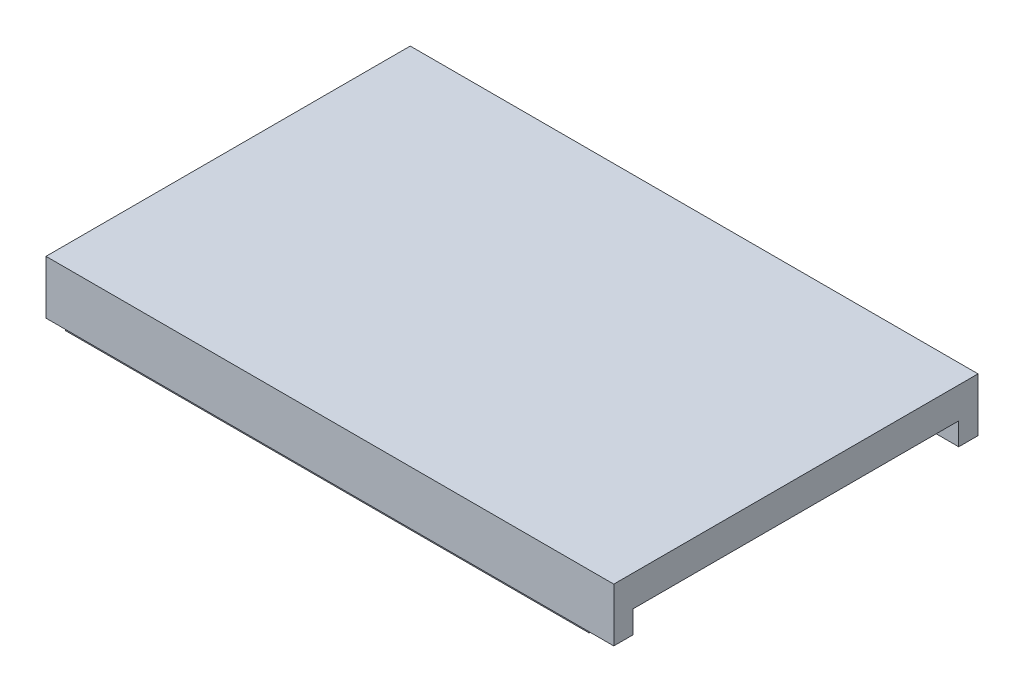
ISO-10303-21;
HEADER;
FILE_DESCRIPTION(('STEP AP214'),'2;1');
FILE_NAME('part.step','',(''),(''),'','','');
FILE_SCHEMA(('AUTOMOTIVE_DESIGN { 1 0 10303 214 1 1 1 1 }'));
ENDSEC;
DATA;
#1=APPLICATION_CONTEXT('core data for automotive mechanical design processes');
#2=APPLICATION_PROTOCOL_DEFINITION('international standard','automotive_design',2000,#1);
#3=PRODUCT_CONTEXT('',#1,'mechanical');
#4=PRODUCT('Part','Part','',(#3));
#5=PRODUCT_RELATED_PRODUCT_CATEGORY('part','',(#4));
#6=PRODUCT_DEFINITION_FORMATION('','',#4);
#7=PRODUCT_DEFINITION_CONTEXT('part definition',#1,'design');
#8=PRODUCT_DEFINITION('design','',#6,#7);
#9=PRODUCT_DEFINITION_SHAPE('','',#8);
#10=(LENGTH_UNIT() NAMED_UNIT(*) SI_UNIT(.MILLI.,.METRE.));
#11=(NAMED_UNIT(*) PLANE_ANGLE_UNIT() SI_UNIT($,.RADIAN.));
#12=(NAMED_UNIT(*) SI_UNIT($,.STERADIAN.) SOLID_ANGLE_UNIT());
#13=UNCERTAINTY_MEASURE_WITH_UNIT(LENGTH_MEASURE(1.E-05),#10,'distance_accuracy_value','');
#14=(GEOMETRIC_REPRESENTATION_CONTEXT(3) GLOBAL_UNCERTAINTY_ASSIGNED_CONTEXT((#13)) GLOBAL_UNIT_ASSIGNED_CONTEXT((#10,
#11,#12)) REPRESENTATION_CONTEXT('',''));
#15=CARTESIAN_POINT('',(0.,0.,0.));
#16=DIRECTION('',(0.,0.,1.));
#17=DIRECTION('',(1.,0.,0.));
#18=AXIS2_PLACEMENT_3D('',#15,#16,#17);
#19=CARTESIAN_POINT('',(0.,0.5,0.));
#20=DIRECTION('',(0.,-1.,0.));
#21=DIRECTION('',(0.,0.,-1.));
#22=AXIS2_PLACEMENT_3D('',#19,#20,#21);
#23=PLANE('',#22);
#24=DIRECTION('',(1.,0.,0.));
#25=VECTOR('',#24,1.);
#26=CARTESIAN_POINT('',(1.2,0.5,-6.6));
#27=LINE('',#26,#25);
#28=CARTESIAN_POINT('',(1.2,0.5,-6.6));
#29=VERTEX_POINT('',#28);
#30=CARTESIAN_POINT('',(5.,0.5,-6.6));
#31=VERTEX_POINT('',#30);
#32=EDGE_CURVE('E303',#29,#31,#27,.T.);
#33=ORIENTED_EDGE('',*,*,#32,.T.);
#34=CARTESIAN_POINT('',(5.,0.5,-5.));
#35=DIRECTION('',(0.,-1.,0.));
#36=DIRECTION('',(0.,0.,-1.));
#37=AXIS2_PLACEMENT_3D('',#34,#35,#36);
#38=CIRCLE('',#37,1.6);
#39=CARTESIAN_POINT('',(6.6,0.5,-5.));
#40=VERTEX_POINT('',#39);
#41=EDGE_CURVE('E11',#31,#40,#38,.F.);
#42=ORIENTED_EDGE('',*,*,#41,.T.);
#43=DIRECTION('',(0.,0.,1.));
#44=VECTOR('',#43,1.);
#45=CARTESIAN_POINT('',(6.6,0.5,-1.2));
#46=LINE('',#45,#44);
#47=CARTESIAN_POINT('',(6.6,0.5,-1.2));
#48=VERTEX_POINT('',#47);
#49=EDGE_CURVE('E306',#40,#48,#46,.T.);
#50=ORIENTED_EDGE('',*,*,#49,.T.);
#51=DIRECTION('',(-1.,0.,0.));
#52=VECTOR('',#51,1.);
#53=CARTESIAN_POINT('',(1.2,0.5,-1.2));
#54=LINE('',#53,#52);
#55=CARTESIAN_POINT('',(1.2,0.5,-1.2));
#56=VERTEX_POINT('',#55);
#57=EDGE_CURVE('E310',#48,#56,#54,.T.);
#58=ORIENTED_EDGE('',*,*,#57,.T.);
#59=DIRECTION('',(0.,0.,-1.));
#60=VECTOR('',#59,1.);
#61=CARTESIAN_POINT('',(1.2,0.5,-1.2));
#62=LINE('',#61,#60);
#63=EDGE_CURVE('E298',#56,#29,#62,.T.);
#64=ORIENTED_EDGE('',*,*,#63,.T.);
#65=EDGE_LOOP('',(#33,#42,#50,#58,#64));
#66=FACE_BOUND('',#65,.T.);
#67=ADVANCED_FACE('F39',(#66),#23,.T.);
#68=CARTESIAN_POINT('',(1.2,3.5,-1.2));
#69=DIRECTION('',(-1.,0.,0.));
#70=DIRECTION('',(0.,0.,1.));
#71=AXIS2_PLACEMENT_3D('',#68,#69,#70);
#72=PLANE('',#71);
#73=DIRECTION('',(0.,1.,0.));
#74=VECTOR('',#73,1.);
#75=CARTESIAN_POINT('',(1.2,0.5,-28.5));
#76=LINE('',#75,#74);
#77=CARTESIAN_POINT('',(1.2,0.5,-28.5));
#78=VERTEX_POINT('',#77);
#79=CARTESIAN_POINT('',(1.2,3.5,-28.5));
#80=VERTEX_POINT('',#79);
#81=EDGE_CURVE('E285',#78,#80,#76,.T.);
#82=ORIENTED_EDGE('',*,*,#81,.T.);
#83=DIRECTION('',(0.,0.,-1.));
#84=VECTOR('',#83,1.);
#85=CARTESIAN_POINT('',(1.2,3.5,-1.2));
#86=LINE('',#85,#84);
#87=CARTESIAN_POINT('',(1.2,3.5,-6.6));
#88=VERTEX_POINT('',#87);
#89=EDGE_CURVE('E438',#88,#80,#86,.T.);
#90=ORIENTED_EDGE('',*,*,#89,.F.);
#91=DIRECTION('',(0.,1.,0.));
#92=VECTOR('',#91,1.);
#93=CARTESIAN_POINT('',(1.2,0.5,-6.6));
#94=LINE('',#93,#92);
#95=EDGE_CURVE('E320',#29,#88,#94,.T.);
#96=ORIENTED_EDGE('',*,*,#95,.F.);
#97=ORIENTED_EDGE('',*,*,#63,.F.);
#98=DIRECTION('',(0.,-1.,0.));
#99=VECTOR('',#98,1.);
#100=CARTESIAN_POINT('',(1.2,3.5,-1.2));
#101=LINE('',#100,#99);
#102=CARTESIAN_POINT('',(1.2,-1.,-1.2));
#103=VERTEX_POINT('',#102);
#104=EDGE_CURVE('E453',#56,#103,#101,.T.);
#105=ORIENTED_EDGE('',*,*,#104,.T.);
#106=DIRECTION('',(0.,0.,1.));
#107=VECTOR('',#106,1.);
#108=CARTESIAN_POINT('',(1.2,-1.,-1.2));
#109=LINE('',#108,#107);
#110=CARTESIAN_POINT('',(1.2,-1.,-12.));
#111=VERTEX_POINT('',#110);
#112=EDGE_CURVE('E411',#111,#103,#109,.T.);
#113=ORIENTED_EDGE('',*,*,#112,.F.);
#114=DIRECTION('',(0.,1.,0.));
#115=VECTOR('',#114,1.);
#116=CARTESIAN_POINT('',(1.2,-1.,-12.));
#117=LINE('',#116,#115);
#118=CARTESIAN_POINT('',(1.2,0.5,-12.));
#119=VERTEX_POINT('',#118);
#120=EDGE_CURVE('E426',#111,#119,#117,.T.);
#121=ORIENTED_EDGE('',*,*,#120,.T.);
#122=DIRECTION('',(0.,0.,1.));
#123=VECTOR('',#122,1.);
#124=CARTESIAN_POINT('',(1.2,0.5,-12.));
#125=LINE('',#124,#123);
#126=CARTESIAN_POINT('',(1.2,0.5,-22.));
#127=VERTEX_POINT('',#126);
#128=EDGE_CURVE('E347',#127,#119,#125,.T.);
#129=ORIENTED_EDGE('',*,*,#128,.F.);
#130=DIRECTION('',(0.,1.,0.));
#131=VECTOR('',#130,1.);
#132=CARTESIAN_POINT('',(1.2,-1.,-22.));
#133=LINE('',#132,#131);
#134=CARTESIAN_POINT('',(1.2,-1.,-22.));
#135=VERTEX_POINT('',#134);
#136=EDGE_CURVE('E382',#135,#127,#133,.T.);
#137=ORIENTED_EDGE('',*,*,#136,.F.);
#138=DIRECTION('',(0.,0.,1.));
#139=VECTOR('',#138,1.);
#140=CARTESIAN_POINT('',(1.2,-1.,-22.));
#141=LINE('',#140,#139);
#142=CARTESIAN_POINT('',(1.2,-1.,-32.8));
#143=VERTEX_POINT('',#142);
#144=EDGE_CURVE('E380',#143,#135,#141,.T.);
#145=ORIENTED_EDGE('',*,*,#144,.F.);
#146=DIRECTION('',(0.,-1.,0.));
#147=VECTOR('',#146,1.);
#148=CARTESIAN_POINT('',(1.2,3.5,-32.8));
#149=LINE('',#148,#147);
#150=CARTESIAN_POINT('',(1.2,0.5,-32.8));
#151=VERTEX_POINT('',#150);
#152=EDGE_CURVE('E450',#151,#143,#149,.T.);
#153=ORIENTED_EDGE('',*,*,#152,.F.);
#154=DIRECTION('',(0.,0.,-1.));
#155=VECTOR('',#154,1.);
#156=CARTESIAN_POINT('',(1.2,0.5,-32.8));
#157=LINE('',#156,#155);
#158=EDGE_CURVE('E59',#78,#151,#157,.T.);
#159=ORIENTED_EDGE('',*,*,#158,.F.);
#160=EDGE_LOOP('',(#82,#90,#96,#97,#105,#113,#121,#129,#137,#145,#153,#159));
#161=FACE_BOUND('',#160,.T.);
#162=ADVANCED_FACE('F544',(#161),#72,.F.);
#163=CARTESIAN_POINT('',(0.,3.5,0.));
#164=DIRECTION('',(0.,-1.,0.));
#165=DIRECTION('',(0.,0.,-1.));
#166=AXIS2_PLACEMENT_3D('',#163,#164,#165);
#167=PLANE('',#166);
#168=DIRECTION('',(-1.,0.,0.));
#169=VECTOR('',#168,1.);
#170=CARTESIAN_POINT('',(1.2,3.5,-28.5));
#171=LINE('',#170,#169);
#172=CARTESIAN_POINT('',(6.6,3.5,-28.5));
#173=VERTEX_POINT('',#172);
#174=EDGE_CURVE('E277',#173,#80,#171,.T.);
#175=ORIENTED_EDGE('',*,*,#174,.F.);
#176=DIRECTION('',(0.,0.,1.));
#177=VECTOR('',#176,1.);
#178=CARTESIAN_POINT('',(6.6,3.5,-32.8));
#179=LINE('',#178,#177);
#180=CARTESIAN_POINT('',(6.6,3.5,-32.8));
#181=VERTEX_POINT('',#180);
#182=EDGE_CURVE('E273',#181,#173,#179,.T.);
#183=ORIENTED_EDGE('',*,*,#182,.F.);
#184=DIRECTION('',(1.,0.,0.));
#185=VECTOR('',#184,1.);
#186=CARTESIAN_POINT('',(1.2,3.5,-32.8));
#187=LINE('',#186,#185);
#188=CARTESIAN_POINT('',(49.8,3.5,-32.8));
#189=VERTEX_POINT('',#188);
#190=EDGE_CURVE('E441',#181,#189,#187,.T.);
#191=ORIENTED_EDGE('',*,*,#190,.T.);
#192=DIRECTION('',(0.,0.,1.));
#193=VECTOR('',#192,1.);
#194=CARTESIAN_POINT('',(49.8,3.5,-1.2));
#195=LINE('',#194,#193);
#196=CARTESIAN_POINT('',(49.8,3.5,-1.2));
#197=VERTEX_POINT('',#196);
#198=EDGE_CURVE('E444',#189,#197,#195,.T.);
#199=ORIENTED_EDGE('',*,*,#198,.T.);
#200=DIRECTION('',(-1.,0.,0.));
#201=VECTOR('',#200,1.);
#202=CARTESIAN_POINT('',(1.2,3.5,-1.2));
#203=LINE('',#202,#201);
#204=CARTESIAN_POINT('',(6.6,3.5,-1.2));
#205=VERTEX_POINT('',#204);
#206=EDGE_CURVE('E447',#197,#205,#203,.T.);
#207=ORIENTED_EDGE('',*,*,#206,.T.);
#208=DIRECTION('',(0.,0.,1.));
#209=VECTOR('',#208,1.);
#210=CARTESIAN_POINT('',(6.6,3.5,-1.2));
#211=LINE('',#210,#209);
#212=CARTESIAN_POINT('',(6.6,3.5,-6.6));
#213=VERTEX_POINT('',#212);
#214=EDGE_CURVE('E302',#213,#205,#211,.T.);
#215=ORIENTED_EDGE('',*,*,#214,.F.);
#216=DIRECTION('',(1.,0.,0.));
#217=VECTOR('',#216,1.);
#218=CARTESIAN_POINT('',(1.2,3.5,-6.6));
#219=LINE('',#218,#217);
#220=EDGE_CURVE('E297',#88,#213,#219,.T.);
#221=ORIENTED_EDGE('',*,*,#220,.F.);
#222=ORIENTED_EDGE('',*,*,#89,.T.);
#223=EDGE_LOOP('',(#175,#183,#191,#199,#207,#215,#221,#222));
#224=FACE_BOUND('',#223,.T.);
#225=ADVANCED_FACE('F585',(#224),#167,.T.);
#226=CARTESIAN_POINT('',(1.2,3.5,-32.8));
#227=DIRECTION('',(0.,0.,-1.));
#228=DIRECTION('',(-1.,0.,0.));
#229=AXIS2_PLACEMENT_3D('',#226,#227,#228);
#230=PLANE('',#229);
#231=DIRECTION('',(0.,1.,0.));
#232=VECTOR('',#231,1.);
#233=CARTESIAN_POINT('',(6.6,0.5,-32.8));
#234=LINE('',#233,#232);
#235=CARTESIAN_POINT('',(6.6,0.5,-32.8));
#236=VERTEX_POINT('',#235);
#237=EDGE_CURVE('E294',#236,#181,#234,.T.);
#238=ORIENTED_EDGE('',*,*,#237,.F.);
#239=DIRECTION('',(1.,0.,0.));
#240=VECTOR('',#239,1.);
#241=CARTESIAN_POINT('',(1.2,0.5,-32.8));
#242=LINE('',#241,#240);
#243=EDGE_CURVE('E276',#151,#236,#242,.T.);
#244=ORIENTED_EDGE('',*,*,#243,.F.);
#245=ORIENTED_EDGE('',*,*,#152,.T.);
#246=DIRECTION('',(-1.,0.,0.));
#247=VECTOR('',#246,1.);
#248=CARTESIAN_POINT('',(1.2,-1.,-32.8));
#249=LINE('',#248,#247);
#250=CARTESIAN_POINT('',(49.8,-1.,-32.8));
#251=VERTEX_POINT('',#250);
#252=EDGE_CURVE('E377',#251,#143,#249,.T.);
#253=ORIENTED_EDGE('',*,*,#252,.F.);
#254=DIRECTION('',(0.,1.,0.));
#255=VECTOR('',#254,1.);
#256=CARTESIAN_POINT('',(49.8,-1.,-32.8));
#257=LINE('',#256,#255);
#258=CARTESIAN_POINT('',(49.8,0.,-32.8));
#259=VERTEX_POINT('',#258);
#260=EDGE_CURVE('E389',#251,#259,#257,.T.);
#261=ORIENTED_EDGE('',*,*,#260,.T.);
#262=DIRECTION('',(0.,-1.,0.));
#263=VECTOR('',#262,1.);
#264=CARTESIAN_POINT('',(49.8,3.5,-32.8));
#265=LINE('',#264,#263);
#266=EDGE_CURVE('E459',#189,#259,#265,.T.);
#267=ORIENTED_EDGE('',*,*,#266,.F.);
#268=ORIENTED_EDGE('',*,*,#190,.F.);
#269=EDGE_LOOP('',(#238,#244,#245,#253,#261,#267,#268));
#270=FACE_BOUND('',#269,.T.);
#271=ADVANCED_FACE('F640',(#270),#230,.F.);
#272=CARTESIAN_POINT('',(1.2,3.5,-1.2));
#273=DIRECTION('',(0.,0.,1.));
#274=DIRECTION('',(1.,0.,0.));
#275=AXIS2_PLACEMENT_3D('',#272,#273,#274);
#276=PLANE('',#275);
#277=DIRECTION('',(0.,1.,0.));
#278=VECTOR('',#277,1.);
#279=CARTESIAN_POINT('',(6.6,0.5,-1.2));
#280=LINE('',#279,#278);
#281=EDGE_CURVE('E312',#48,#205,#280,.T.);
#282=ORIENTED_EDGE('',*,*,#281,.T.);
#283=ORIENTED_EDGE('',*,*,#206,.F.);
#284=DIRECTION('',(0.,-1.,0.));
#285=VECTOR('',#284,1.);
#286=CARTESIAN_POINT('',(49.8,3.5,-1.2));
#287=LINE('',#286,#285);
#288=CARTESIAN_POINT('',(49.8,0.,-1.2));
#289=VERTEX_POINT('',#288);
#290=EDGE_CURVE('E456',#197,#289,#287,.T.);
#291=ORIENTED_EDGE('',*,*,#290,.T.);
#292=DIRECTION('',(0.,1.,0.));
#293=VECTOR('',#292,1.);
#294=CARTESIAN_POINT('',(49.8,-1.,-1.2));
#295=LINE('',#294,#293);
#296=CARTESIAN_POINT('',(49.8,-1.,-1.2));
#297=VERTEX_POINT('',#296);
#298=EDGE_CURVE('E416',#297,#289,#295,.T.);
#299=ORIENTED_EDGE('',*,*,#298,.F.);
#300=DIRECTION('',(1.,0.,0.));
#301=VECTOR('',#300,1.);
#302=CARTESIAN_POINT('',(49.8,-1.,-1.2));
#303=LINE('',#302,#301);
#304=EDGE_CURVE('E414',#103,#297,#303,.T.);
#305=ORIENTED_EDGE('',*,*,#304,.F.);
#306=ORIENTED_EDGE('',*,*,#104,.F.);
#307=ORIENTED_EDGE('',*,*,#57,.F.);
#308=EDGE_LOOP('',(#282,#283,#291,#299,#305,#306,#307));
#309=FACE_BOUND('',#308,.T.);
#310=ADVANCED_FACE('F564',(#309),#276,.F.);
#311=CARTESIAN_POINT('',(0.,0.,0.));
#312=DIRECTION('',(0.,-1.,0.));
#313=DIRECTION('',(0.,0.,-1.));
#314=AXIS2_PLACEMENT_3D('',#311,#312,#313);
#315=PLANE('',#314);
#316=DIRECTION('',(-1.,0.,0.));
#317=VECTOR('',#316,1.);
#318=CARTESIAN_POINT('',(49.8,0.,-1.8));
#319=LINE('',#318,#317);
#320=CARTESIAN_POINT('',(53.,0.,-1.8));
#321=VERTEX_POINT('',#320);
#322=CARTESIAN_POINT('',(49.8,0.,-1.8));
#323=VERTEX_POINT('',#322);
#324=EDGE_CURVE('E327',#321,#323,#319,.T.);
#325=ORIENTED_EDGE('',*,*,#324,.F.);
#326=DIRECTION('',(0.,0.,-1.));
#327=VECTOR('',#326,1.);
#328=CARTESIAN_POINT('',(53.,0.,0.));
#329=LINE('',#328,#327);
#330=CARTESIAN_POINT('',(53.,0.,0.));
#331=VERTEX_POINT('',#330);
#332=EDGE_CURVE('E480',#331,#321,#329,.T.);
#333=ORIENTED_EDGE('',*,*,#332,.F.);
#334=DIRECTION('',(1.,0.,0.));
#335=VECTOR('',#334,1.);
#336=CARTESIAN_POINT('',(0.,0.,0.));
#337=LINE('',#336,#335);
#338=CARTESIAN_POINT('',(0.,0.,0.));
#339=VERTEX_POINT('',#338);
#340=EDGE_CURVE('E477',#339,#331,#337,.T.);
#341=ORIENTED_EDGE('',*,*,#340,.F.);
#342=DIRECTION('',(0.,0.,1.));
#343=VECTOR('',#342,1.);
#344=CARTESIAN_POINT('',(0.,0.,0.));
#345=LINE('',#344,#343);
#346=CARTESIAN_POINT('',(0.,0.,-12.));
#347=VERTEX_POINT('',#346);
#348=EDGE_CURVE('E455',#347,#339,#345,.T.);
#349=ORIENTED_EDGE('',*,*,#348,.F.);
#350=DIRECTION('',(-1.,0.,0.));
#351=VECTOR('',#350,1.);
#352=CARTESIAN_POINT('',(1.2,0.,-12.));
#353=LINE('',#352,#351);
#354=CARTESIAN_POINT('',(0.9,0.,-12.));
#355=VERTEX_POINT('',#354);
#356=EDGE_CURVE('E340',#355,#347,#353,.T.);
#357=ORIENTED_EDGE('',*,*,#356,.F.);
#358=DIRECTION('',(0.,0.,-1.));
#359=VECTOR('',#358,1.);
#360=CARTESIAN_POINT('',(0.9,0.,-0.9));
#361=LINE('',#360,#359);
#362=CARTESIAN_POINT('',(0.9,0.,-0.9));
#363=VERTEX_POINT('',#362);
#364=EDGE_CURVE('E405',#363,#355,#361,.T.);
#365=ORIENTED_EDGE('',*,*,#364,.F.);
#366=DIRECTION('',(-1.,0.,0.));
#367=VECTOR('',#366,1.);
#368=CARTESIAN_POINT('',(49.8,0.,-0.9));
#369=LINE('',#368,#367);
#370=CARTESIAN_POINT('',(49.8,0.,-0.9));
#371=VERTEX_POINT('',#370);
#372=EDGE_CURVE('E419',#371,#363,#369,.T.);
#373=ORIENTED_EDGE('',*,*,#372,.F.);
#374=DIRECTION('',(0.,0.,1.));
#375=VECTOR('',#374,1.);
#376=CARTESIAN_POINT('',(49.8,0.,-0.9));
#377=LINE('',#376,#375);
#378=EDGE_CURVE('E400',#289,#371,#377,.T.);
#379=ORIENTED_EDGE('',*,*,#378,.F.);
#380=DIRECTION('',(0.,0.,1.));
#381=VECTOR('',#380,1.);
#382=CARTESIAN_POINT('',(49.8,0.,-1.2));
#383=LINE('',#382,#381);
#384=EDGE_CURVE('E437',#323,#289,#383,.T.);
#385=ORIENTED_EDGE('',*,*,#384,.F.);
#386=EDGE_LOOP('',(#325,#333,#341,#349,#357,#365,#373,#379,#385));
#387=FACE_BOUND('',#386,.T.);
#388=ADVANCED_FACE('F504',(#387),#315,.T.);
#389=DIRECTION('',(1.,0.,0.));
#390=VECTOR('',#389,1.);
#391=CARTESIAN_POINT('',(49.8,0.,-32.2));
#392=LINE('',#391,#390);
#393=CARTESIAN_POINT('',(49.8,0.,-32.2));
#394=VERTEX_POINT('',#393);
#395=CARTESIAN_POINT('',(53.,0.,-32.2));
#396=VERTEX_POINT('',#395);
#397=EDGE_CURVE('E322',#394,#396,#392,.T.);
#398=ORIENTED_EDGE('',*,*,#397,.F.);
#399=EDGE_CURVE('E442',#259,#394,#383,.T.);
#400=ORIENTED_EDGE('',*,*,#399,.F.);
#401=DIRECTION('',(0.,0.,1.));
#402=VECTOR('',#401,1.);
#403=CARTESIAN_POINT('',(49.8,0.,-32.8));
#404=LINE('',#403,#402);
#405=CARTESIAN_POINT('',(49.8,0.,-33.1));
#406=VERTEX_POINT('',#405);
#407=EDGE_CURVE('E371',#406,#259,#404,.T.);
#408=ORIENTED_EDGE('',*,*,#407,.F.);
#409=DIRECTION('',(1.,0.,0.));
#410=VECTOR('',#409,1.);
#411=CARTESIAN_POINT('',(0.9,0.,-33.1));
#412=LINE('',#411,#410);
#413=CARTESIAN_POINT('',(0.9,0.,-33.1));
#414=VERTEX_POINT('',#413);
#415=EDGE_CURVE('E384',#414,#406,#412,.T.);
#416=ORIENTED_EDGE('',*,*,#415,.F.);
#417=DIRECTION('',(0.,0.,-1.));
#418=VECTOR('',#417,1.);
#419=CARTESIAN_POINT('',(0.9,0.,-22.));
#420=LINE('',#419,#418);
#421=CARTESIAN_POINT('',(0.9,0.,-22.));
#422=VERTEX_POINT('',#421);
#423=EDGE_CURVE('E364',#422,#414,#420,.T.);
#424=ORIENTED_EDGE('',*,*,#423,.F.);
#425=DIRECTION('',(1.,0.,0.));
#426=VECTOR('',#425,1.);
#427=CARTESIAN_POINT('',(1.2,0.,-22.));
#428=LINE('',#427,#426);
#429=CARTESIAN_POINT('',(0.,0.,-22.));
#430=VERTEX_POINT('',#429);
#431=EDGE_CURVE('E351',#430,#422,#428,.T.);
#432=ORIENTED_EDGE('',*,*,#431,.F.);
#433=CARTESIAN_POINT('',(0.,0.,-34.));
#434=VERTEX_POINT('',#433);
#435=EDGE_CURVE('E474',#434,#430,#345,.T.);
#436=ORIENTED_EDGE('',*,*,#435,.F.);
#437=DIRECTION('',(-1.,0.,0.));
#438=VECTOR('',#437,1.);
#439=CARTESIAN_POINT('',(0.,0.,-34.));
#440=LINE('',#439,#438);
#441=CARTESIAN_POINT('',(53.,0.,-34.));
#442=VERTEX_POINT('',#441);
#443=EDGE_CURVE('E467',#442,#434,#440,.T.);
#444=ORIENTED_EDGE('',*,*,#443,.F.);
#445=EDGE_CURVE('E479',#396,#442,#329,.T.);
#446=ORIENTED_EDGE('',*,*,#445,.F.);
#447=EDGE_LOOP('',(#398,#400,#408,#416,#424,#432,#436,#444,#446));
#448=FACE_BOUND('',#447,.T.);
#449=ADVANCED_FACE('F524',(#448),#315,.T.);
#450=CARTESIAN_POINT('',(0.,5.,0.));
#451=DIRECTION('',(1.,0.,0.));
#452=DIRECTION('',(0.,0.,-1.));
#453=AXIS2_PLACEMENT_3D('',#450,#451,#452);
#454=PLANE('',#453);
#455=ORIENTED_EDGE('',*,*,#435,.T.);
#456=DIRECTION('',(0.,-1.,0.));
#457=VECTOR('',#456,1.);
#458=CARTESIAN_POINT('',(0.,0.5,-22.));
#459=LINE('',#458,#457);
#460=CARTESIAN_POINT('',(0.,0.5,-22.));
#461=VERTEX_POINT('',#460);
#462=EDGE_CURVE('E362',#461,#430,#459,.T.);
#463=ORIENTED_EDGE('',*,*,#462,.F.);
#464=DIRECTION('',(0.,0.,-1.));
#465=VECTOR('',#464,1.);
#466=CARTESIAN_POINT('',(0.,0.5,-12.));
#467=LINE('',#466,#465);
#468=CARTESIAN_POINT('',(0.,0.5,-12.));
#469=VERTEX_POINT('',#468);
#470=EDGE_CURVE('E354',#469,#461,#467,.T.);
#471=ORIENTED_EDGE('',*,*,#470,.F.);
#472=DIRECTION('',(0.,-1.,0.));
#473=VECTOR('',#472,1.);
#474=CARTESIAN_POINT('',(0.,0.5,-12.));
#475=LINE('',#474,#473);
#476=EDGE_CURVE('E359',#469,#347,#475,.T.);
#477=ORIENTED_EDGE('',*,*,#476,.T.);
#478=ORIENTED_EDGE('',*,*,#348,.T.);
#479=DIRECTION('',(0.,-1.,0.));
#480=VECTOR('',#479,1.);
#481=CARTESIAN_POINT('',(0.,5.,0.));
#482=LINE('',#481,#480);
#483=CARTESIAN_POINT('',(0.,5.,0.));
#484=VERTEX_POINT('',#483);
#485=EDGE_CURVE('E47',#484,#339,#482,.T.);
#486=ORIENTED_EDGE('',*,*,#485,.F.);
#487=DIRECTION('',(0.,0.,1.));
#488=VECTOR('',#487,1.);
#489=CARTESIAN_POINT('',(0.,5.,0.));
#490=LINE('',#489,#488);
#491=CARTESIAN_POINT('',(0.,5.,-34.));
#492=VERTEX_POINT('',#491);
#493=EDGE_CURVE('E463',#492,#484,#490,.T.);
#494=ORIENTED_EDGE('',*,*,#493,.F.);
#495=DIRECTION('',(0.,-1.,0.));
#496=VECTOR('',#495,1.);
#497=CARTESIAN_POINT('',(0.,5.,-34.));
#498=LINE('',#497,#496);
#499=EDGE_CURVE('E473',#492,#434,#498,.T.);
#500=ORIENTED_EDGE('',*,*,#499,.T.);
#501=EDGE_LOOP('',(#455,#463,#471,#477,#478,#486,#494,#500));
#502=FACE_BOUND('',#501,.T.);
#503=ADVANCED_FACE('F41',(#502),#454,.F.);
#504=CARTESIAN_POINT('',(0.,5.,0.));
#505=DIRECTION('',(0.,0.,-1.));
#506=DIRECTION('',(-1.,0.,0.));
#507=AXIS2_PLACEMENT_3D('',#504,#505,#506);
#508=PLANE('',#507);
#509=ORIENTED_EDGE('',*,*,#340,.T.);
#510=DIRECTION('',(0.,-1.,0.));
#511=VECTOR('',#510,1.);
#512=CARTESIAN_POINT('',(53.,5.,0.));
#513=LINE('',#512,#511);
#514=CARTESIAN_POINT('',(53.,5.,0.));
#515=VERTEX_POINT('',#514);
#516=EDGE_CURVE('E489',#515,#331,#513,.T.);
#517=ORIENTED_EDGE('',*,*,#516,.F.);
#518=DIRECTION('',(1.,0.,0.));
#519=VECTOR('',#518,1.);
#520=CARTESIAN_POINT('',(0.,5.,0.));
#521=LINE('',#520,#519);
#522=EDGE_CURVE('E466',#484,#515,#521,.T.);
#523=ORIENTED_EDGE('',*,*,#522,.F.);
#524=ORIENTED_EDGE('',*,*,#485,.T.);
#525=EDGE_LOOP('',(#509,#517,#523,#524));
#526=FACE_BOUND('',#525,.T.);
#527=ADVANCED_FACE('F494',(#526),#508,.F.);
#528=CARTESIAN_POINT('',(53.,5.,0.));
#529=DIRECTION('',(-1.,0.,0.));
#530=DIRECTION('',(0.,0.,1.));
#531=AXIS2_PLACEMENT_3D('',#528,#529,#530);
#532=PLANE('',#531);
#533=ORIENTED_EDGE('',*,*,#332,.T.);
#534=DIRECTION('',(0.,-1.,0.));
#535=VECTOR('',#534,1.);
#536=CARTESIAN_POINT('',(53.,2.1,-1.8));
#537=LINE('',#536,#535);
#538=CARTESIAN_POINT('',(53.,2.1,-1.8));
#539=VERTEX_POINT('',#538);
#540=EDGE_CURVE('E341',#539,#321,#537,.T.);
#541=ORIENTED_EDGE('',*,*,#540,.F.);
#542=DIRECTION('',(0.,0.,1.));
#543=VECTOR('',#542,1.);
#544=CARTESIAN_POINT('',(53.,2.1,-1.8));
#545=LINE('',#544,#543);
#546=CARTESIAN_POINT('',(53.,2.1,-32.2));
#547=VERTEX_POINT('',#546);
#548=EDGE_CURVE('E330',#547,#539,#545,.T.);
#549=ORIENTED_EDGE('',*,*,#548,.F.);
#550=DIRECTION('',(0.,-1.,0.));
#551=VECTOR('',#550,1.);
#552=CARTESIAN_POINT('',(53.,2.1,-32.2));
#553=LINE('',#552,#551);
#554=EDGE_CURVE('E343',#547,#396,#553,.T.);
#555=ORIENTED_EDGE('',*,*,#554,.T.);
#556=ORIENTED_EDGE('',*,*,#445,.T.);
#557=DIRECTION('',(0.,-1.,0.));
#558=VECTOR('',#557,1.);
#559=CARTESIAN_POINT('',(53.,5.,-34.));
#560=LINE('',#559,#558);
#561=CARTESIAN_POINT('',(53.,5.,-34.));
#562=VERTEX_POINT('',#561);
#563=EDGE_CURVE('E486',#562,#442,#560,.T.);
#564=ORIENTED_EDGE('',*,*,#563,.F.);
#565=DIRECTION('',(0.,0.,-1.));
#566=VECTOR('',#565,1.);
#567=CARTESIAN_POINT('',(53.,5.,0.));
#568=LINE('',#567,#566);
#569=EDGE_CURVE('E469',#515,#562,#568,.T.);
#570=ORIENTED_EDGE('',*,*,#569,.F.);
#571=ORIENTED_EDGE('',*,*,#516,.T.);
#572=EDGE_LOOP('',(#533,#541,#549,#555,#556,#564,#570,#571));
#573=FACE_BOUND('',#572,.T.);
#574=ADVANCED_FACE('F508',(#573),#532,.F.);
#575=CARTESIAN_POINT('',(0.,5.,-34.));
#576=DIRECTION('',(0.,0.,1.));
#577=DIRECTION('',(1.,0.,0.));
#578=AXIS2_PLACEMENT_3D('',#575,#576,#577);
#579=PLANE('',#578);
#580=ORIENTED_EDGE('',*,*,#443,.T.);
#581=ORIENTED_EDGE('',*,*,#499,.F.);
#582=DIRECTION('',(-1.,0.,0.));
#583=VECTOR('',#582,1.);
#584=CARTESIAN_POINT('',(0.,5.,-34.));
#585=LINE('',#584,#583);
#586=EDGE_CURVE('E471',#562,#492,#585,.T.);
#587=ORIENTED_EDGE('',*,*,#586,.F.);
#588=ORIENTED_EDGE('',*,*,#563,.T.);
#589=EDGE_LOOP('',(#580,#581,#587,#588));
#590=FACE_BOUND('',#589,.T.);
#591=ADVANCED_FACE('F517',(#590),#579,.F.);
#592=CARTESIAN_POINT('',(0.,5.,0.));
#593=DIRECTION('',(0.,-1.,0.));
#594=DIRECTION('',(0.,0.,-1.));
#595=AXIS2_PLACEMENT_3D('',#592,#593,#594);
#596=PLANE('',#595);
#597=ORIENTED_EDGE('',*,*,#493,.T.);
#598=ORIENTED_EDGE('',*,*,#522,.T.);
#599=ORIENTED_EDGE('',*,*,#569,.T.);
#600=ORIENTED_EDGE('',*,*,#586,.T.);
#601=EDGE_LOOP('',(#597,#598,#599,#600));
#602=FACE_BOUND('',#601,.T.);
#603=ADVANCED_FACE('F514',(#602),#596,.F.);
#604=CARTESIAN_POINT('',(49.8,3.5,-1.2));
#605=DIRECTION('',(1.,0.,0.));
#606=DIRECTION('',(0.,0.,-1.));
#607=AXIS2_PLACEMENT_3D('',#604,#605,#606);
#608=PLANE('',#607);
#609=DIRECTION('',(0.,0.,-1.));
#610=VECTOR('',#609,1.);
#611=CARTESIAN_POINT('',(49.8,2.1,-1.8));
#612=LINE('',#611,#610);
#613=CARTESIAN_POINT('',(49.8,2.1,-1.8));
#614=VERTEX_POINT('',#613);
#615=CARTESIAN_POINT('',(49.8,2.1,-32.2));
#616=VERTEX_POINT('',#615);
#617=EDGE_CURVE('E323',#614,#616,#612,.T.);
#618=ORIENTED_EDGE('',*,*,#617,.F.);
#619=DIRECTION('',(0.,-1.,0.));
#620=VECTOR('',#619,1.);
#621=CARTESIAN_POINT('',(49.8,2.1,-1.8));
#622=LINE('',#621,#620);
#623=EDGE_CURVE('E337',#614,#323,#622,.T.);
#624=ORIENTED_EDGE('',*,*,#623,.T.);
#625=ORIENTED_EDGE('',*,*,#384,.T.);
#626=ORIENTED_EDGE('',*,*,#290,.F.);
#627=ORIENTED_EDGE('',*,*,#198,.F.);
#628=ORIENTED_EDGE('',*,*,#266,.T.);
#629=ORIENTED_EDGE('',*,*,#399,.T.);
#630=DIRECTION('',(0.,-1.,0.));
#631=VECTOR('',#630,1.);
#632=CARTESIAN_POINT('',(49.8,2.1,-32.2));
#633=LINE('',#632,#631);
#634=EDGE_CURVE('E334',#616,#394,#633,.T.);
#635=ORIENTED_EDGE('',*,*,#634,.F.);
#636=EDGE_LOOP('',(#618,#624,#625,#626,#627,#628,#629,#635));
#637=FACE_BOUND('',#636,.T.);
#638=ADVANCED_FACE('F590',(#637),#608,.F.);
#639=CARTESIAN_POINT('',(49.8,-1.,-0.9));
#640=DIRECTION('',(-1.,0.,0.));
#641=DIRECTION('',(0.,0.,1.));
#642=AXIS2_PLACEMENT_3D('',#639,#640,#641);
#643=PLANE('',#642);
#644=ORIENTED_EDGE('',*,*,#378,.T.);
#645=DIRECTION('',(0.,1.,0.));
#646=VECTOR('',#645,1.);
#647=CARTESIAN_POINT('',(49.8,-1.,-0.9));
#648=LINE('',#647,#646);
#649=CARTESIAN_POINT('',(49.8,-1.,-0.9));
#650=VERTEX_POINT('',#649);
#651=EDGE_CURVE('E434',#650,#371,#648,.T.);
#652=ORIENTED_EDGE('',*,*,#651,.F.);
#653=DIRECTION('',(0.,0.,1.));
#654=VECTOR('',#653,1.);
#655=CARTESIAN_POINT('',(49.8,-1.,-0.9));
#656=LINE('',#655,#654);
#657=EDGE_CURVE('E401',#297,#650,#656,.T.);
#658=ORIENTED_EDGE('',*,*,#657,.F.);
#659=ORIENTED_EDGE('',*,*,#298,.T.);
#660=EDGE_LOOP('',(#644,#652,#658,#659));
#661=FACE_BOUND('',#660,.T.);
#662=ADVANCED_FACE('F569',(#661),#643,.F.);
#663=CARTESIAN_POINT('',(49.8,-1.,-0.9));
#664=DIRECTION('',(0.,0.,-1.));
#665=DIRECTION('',(-1.,0.,0.));
#666=AXIS2_PLACEMENT_3D('',#663,#664,#665);
#667=PLANE('',#666);
#668=ORIENTED_EDGE('',*,*,#372,.T.);
#669=DIRECTION('',(0.,1.,0.));
#670=VECTOR('',#669,1.);
#671=CARTESIAN_POINT('',(0.9,-1.,-0.9));
#672=LINE('',#671,#670);
#673=CARTESIAN_POINT('',(0.9,-1.,-0.9));
#674=VERTEX_POINT('',#673);
#675=EDGE_CURVE('E431',#674,#363,#672,.T.);
#676=ORIENTED_EDGE('',*,*,#675,.F.);
#677=DIRECTION('',(-1.,0.,0.));
#678=VECTOR('',#677,1.);
#679=CARTESIAN_POINT('',(49.8,-1.,-0.9));
#680=LINE('',#679,#678);
#681=EDGE_CURVE('E404',#650,#674,#680,.T.);
#682=ORIENTED_EDGE('',*,*,#681,.F.);
#683=ORIENTED_EDGE('',*,*,#651,.T.);
#684=EDGE_LOOP('',(#668,#676,#682,#683));
#685=FACE_BOUND('',#684,.T.);
#686=ADVANCED_FACE('F557',(#685),#667,.F.);
#687=CARTESIAN_POINT('',(0.9,-1.,-0.9));
#688=DIRECTION('',(1.,0.,0.));
#689=DIRECTION('',(0.,0.,-1.));
#690=AXIS2_PLACEMENT_3D('',#687,#688,#689);
#691=PLANE('',#690);
#692=ORIENTED_EDGE('',*,*,#364,.T.);
#693=DIRECTION('',(0.,1.,0.));
#694=VECTOR('',#693,1.);
#695=CARTESIAN_POINT('',(0.9,-1.,-12.));
#696=LINE('',#695,#694);
#697=CARTESIAN_POINT('',(0.9,-1.,-12.));
#698=VERTEX_POINT('',#697);
#699=EDGE_CURVE('E428',#698,#355,#696,.T.);
#700=ORIENTED_EDGE('',*,*,#699,.F.);
#701=DIRECTION('',(0.,0.,-1.));
#702=VECTOR('',#701,1.);
#703=CARTESIAN_POINT('',(0.9,-1.,-0.9));
#704=LINE('',#703,#702);
#705=EDGE_CURVE('E407',#674,#698,#704,.T.);
#706=ORIENTED_EDGE('',*,*,#705,.F.);
#707=ORIENTED_EDGE('',*,*,#675,.T.);
#708=EDGE_LOOP('',(#692,#700,#706,#707));
#709=FACE_BOUND('',#708,.T.);
#710=ADVANCED_FACE('F553',(#709),#691,.F.);
#711=CARTESIAN_POINT('',(0.9,-1.,-12.));
#712=DIRECTION('',(0.,0.,1.));
#713=DIRECTION('',(1.,0.,0.));
#714=AXIS2_PLACEMENT_3D('',#711,#712,#713);
#715=PLANE('',#714);
#716=ORIENTED_EDGE('',*,*,#699,.T.);
#717=ORIENTED_EDGE('',*,*,#356,.T.);
#718=ORIENTED_EDGE('',*,*,#476,.F.);
#719=DIRECTION('',(-1.,0.,0.));
#720=VECTOR('',#719,1.);
#721=CARTESIAN_POINT('',(1.2,0.5,-12.));
#722=LINE('',#721,#720);
#723=EDGE_CURVE('E350',#119,#469,#722,.T.);
#724=ORIENTED_EDGE('',*,*,#723,.F.);
#725=ORIENTED_EDGE('',*,*,#120,.F.);
#726=DIRECTION('',(1.,0.,0.));
#727=VECTOR('',#726,1.);
#728=CARTESIAN_POINT('',(0.9,-1.,-12.));
#729=LINE('',#728,#727);
#730=EDGE_CURVE('E409',#698,#111,#729,.T.);
#731=ORIENTED_EDGE('',*,*,#730,.F.);
#732=EDGE_LOOP('',(#716,#717,#718,#724,#725,#731));
#733=FACE_BOUND('',#732,.T.);
#734=ADVANCED_FACE('F550',(#733),#715,.F.);
#735=CARTESIAN_POINT('',(0.,-1.,0.));
#736=DIRECTION('',(0.,1.,0.));
#737=DIRECTION('',(0.,0.,1.));
#738=AXIS2_PLACEMENT_3D('',#735,#736,#737);
#739=PLANE('',#738);
#740=ORIENTED_EDGE('',*,*,#657,.T.);
#741=ORIENTED_EDGE('',*,*,#681,.T.);
#742=ORIENTED_EDGE('',*,*,#705,.T.);
#743=ORIENTED_EDGE('',*,*,#730,.T.);
#744=ORIENTED_EDGE('',*,*,#112,.T.);
#745=ORIENTED_EDGE('',*,*,#304,.T.);
#746=EDGE_LOOP('',(#740,#741,#742,#743,#744,#745));
#747=FACE_BOUND('',#746,.T.);
#748=ADVANCED_FACE('F571',(#747),#739,.F.);
#749=CARTESIAN_POINT('',(0.9,-1.,-22.));
#750=DIRECTION('',(0.,0.,-1.));
#751=DIRECTION('',(-1.,0.,0.));
#752=AXIS2_PLACEMENT_3D('',#749,#750,#751);
#753=PLANE('',#752);
#754=ORIENTED_EDGE('',*,*,#136,.T.);
#755=DIRECTION('',(1.,0.,0.));
#756=VECTOR('',#755,1.);
#757=CARTESIAN_POINT('',(1.2,0.5,-22.));
#758=LINE('',#757,#756);
#759=EDGE_CURVE('E356',#461,#127,#758,.T.);
#760=ORIENTED_EDGE('',*,*,#759,.F.);
#761=ORIENTED_EDGE('',*,*,#462,.T.);
#762=ORIENTED_EDGE('',*,*,#431,.T.);
#763=DIRECTION('',(0.,1.,0.));
#764=VECTOR('',#763,1.);
#765=CARTESIAN_POINT('',(0.9,-1.,-22.));
#766=LINE('',#765,#764);
#767=CARTESIAN_POINT('',(0.9,-1.,-22.));
#768=VERTEX_POINT('',#767);
#769=EDGE_CURVE('E397',#768,#422,#766,.T.);
#770=ORIENTED_EDGE('',*,*,#769,.F.);
#771=DIRECTION('',(-1.,0.,0.));
#772=VECTOR('',#771,1.);
#773=CARTESIAN_POINT('',(0.9,-1.,-22.));
#774=LINE('',#773,#772);
#775=EDGE_CURVE('E367',#135,#768,#774,.T.);
#776=ORIENTED_EDGE('',*,*,#775,.F.);
#777=EDGE_LOOP('',(#754,#760,#761,#762,#770,#776));
#778=FACE_BOUND('',#777,.T.);
#779=ADVANCED_FACE('F530',(#778),#753,.F.);
#780=CARTESIAN_POINT('',(0.9,-1.,-22.));
#781=DIRECTION('',(1.,0.,0.));
#782=DIRECTION('',(0.,0.,-1.));
#783=AXIS2_PLACEMENT_3D('',#780,#781,#782);
#784=PLANE('',#783);
#785=ORIENTED_EDGE('',*,*,#423,.T.);
#786=DIRECTION('',(0.,1.,0.));
#787=VECTOR('',#786,1.);
#788=CARTESIAN_POINT('',(0.9,-1.,-33.1));
#789=LINE('',#788,#787);
#790=CARTESIAN_POINT('',(0.9,-1.,-33.1));
#791=VERTEX_POINT('',#790);
#792=EDGE_CURVE('E394',#791,#414,#789,.T.);
#793=ORIENTED_EDGE('',*,*,#792,.F.);
#794=DIRECTION('',(0.,0.,-1.));
#795=VECTOR('',#794,1.);
#796=CARTESIAN_POINT('',(0.9,-1.,-22.));
#797=LINE('',#796,#795);
#798=EDGE_CURVE('E370',#768,#791,#797,.T.);
#799=ORIENTED_EDGE('',*,*,#798,.F.);
#800=ORIENTED_EDGE('',*,*,#769,.T.);
#801=EDGE_LOOP('',(#785,#793,#799,#800));
#802=FACE_BOUND('',#801,.T.);
#803=ADVANCED_FACE('F534',(#802),#784,.F.);
#804=CARTESIAN_POINT('',(0.9,-1.,-33.1));
#805=DIRECTION('',(0.,0.,1.));
#806=DIRECTION('',(1.,0.,0.));
#807=AXIS2_PLACEMENT_3D('',#804,#805,#806);
#808=PLANE('',#807);
#809=ORIENTED_EDGE('',*,*,#415,.T.);
#810=DIRECTION('',(0.,1.,0.));
#811=VECTOR('',#810,1.);
#812=CARTESIAN_POINT('',(49.8,-1.,-33.1));
#813=LINE('',#812,#811);
#814=CARTESIAN_POINT('',(49.8,-1.,-33.1));
#815=VERTEX_POINT('',#814);
#816=EDGE_CURVE('E391',#815,#406,#813,.T.);
#817=ORIENTED_EDGE('',*,*,#816,.F.);
#818=DIRECTION('',(1.,0.,0.));
#819=VECTOR('',#818,1.);
#820=CARTESIAN_POINT('',(0.9,-1.,-33.1));
#821=LINE('',#820,#819);
#822=EDGE_CURVE('E373',#791,#815,#821,.T.);
#823=ORIENTED_EDGE('',*,*,#822,.F.);
#824=ORIENTED_EDGE('',*,*,#792,.T.);
#825=EDGE_LOOP('',(#809,#817,#823,#824));
#826=FACE_BOUND('',#825,.T.);
#827=ADVANCED_FACE('F903',(#826),#808,.F.);
#828=CARTESIAN_POINT('',(49.8,-1.,-32.8));
#829=DIRECTION('',(-1.,0.,0.));
#830=DIRECTION('',(0.,0.,1.));
#831=AXIS2_PLACEMENT_3D('',#828,#829,#830);
#832=PLANE('',#831);
#833=ORIENTED_EDGE('',*,*,#407,.T.);
#834=ORIENTED_EDGE('',*,*,#260,.F.);
#835=DIRECTION('',(0.,0.,1.));
#836=VECTOR('',#835,1.);
#837=CARTESIAN_POINT('',(49.8,-1.,-32.8));
#838=LINE('',#837,#836);
#839=EDGE_CURVE('E375',#815,#251,#838,.T.);
#840=ORIENTED_EDGE('',*,*,#839,.F.);
#841=ORIENTED_EDGE('',*,*,#816,.T.);
#842=EDGE_LOOP('',(#833,#834,#840,#841));
#843=FACE_BOUND('',#842,.T.);
#844=ADVANCED_FACE('F909',(#843),#832,.F.);
#845=CARTESIAN_POINT('',(0.,-1.,0.));
#846=DIRECTION('',(0.,1.,0.));
#847=DIRECTION('',(0.,0.,1.));
#848=AXIS2_PLACEMENT_3D('',#845,#846,#847);
#849=PLANE('',#848);
#850=ORIENTED_EDGE('',*,*,#775,.T.);
#851=ORIENTED_EDGE('',*,*,#798,.T.);
#852=ORIENTED_EDGE('',*,*,#822,.T.);
#853=ORIENTED_EDGE('',*,*,#839,.T.);
#854=ORIENTED_EDGE('',*,*,#252,.T.);
#855=ORIENTED_EDGE('',*,*,#144,.T.);
#856=EDGE_LOOP('',(#850,#851,#852,#853,#854,#855));
#857=FACE_BOUND('',#856,.T.);
#858=ADVANCED_FACE('F538',(#857),#849,.F.);
#859=CARTESIAN_POINT('',(0.,0.5,0.));
#860=DIRECTION('',(0.,1.,0.));
#861=DIRECTION('',(0.,0.,1.));
#862=AXIS2_PLACEMENT_3D('',#859,#860,#861);
#863=PLANE('',#862);
#864=ORIENTED_EDGE('',*,*,#128,.T.);
#865=ORIENTED_EDGE('',*,*,#723,.T.);
#866=ORIENTED_EDGE('',*,*,#470,.T.);
#867=ORIENTED_EDGE('',*,*,#759,.T.);
#868=EDGE_LOOP('',(#864,#865,#866,#867));
#869=FACE_BOUND('',#868,.T.);
#870=ADVANCED_FACE('F543',(#869),#863,.F.);
#871=CARTESIAN_POINT('',(49.8,2.1,-1.8));
#872=DIRECTION('',(0.,0.,1.));
#873=DIRECTION('',(1.,0.,0.));
#874=AXIS2_PLACEMENT_3D('',#871,#872,#873);
#875=PLANE('',#874);
#876=ORIENTED_EDGE('',*,*,#324,.T.);
#877=ORIENTED_EDGE('',*,*,#623,.F.);
#878=DIRECTION('',(-1.,0.,0.));
#879=VECTOR('',#878,1.);
#880=CARTESIAN_POINT('',(49.8,2.1,-1.8));
#881=LINE('',#880,#879);
#882=EDGE_CURVE('E332',#539,#614,#881,.T.);
#883=ORIENTED_EDGE('',*,*,#882,.F.);
#884=ORIENTED_EDGE('',*,*,#540,.T.);
#885=EDGE_LOOP('',(#876,#877,#883,#884));
#886=FACE_BOUND('',#885,.T.);
#887=ADVANCED_FACE('F602',(#886),#875,.F.);
#888=CARTESIAN_POINT('',(49.8,2.1,-32.2));
#889=DIRECTION('',(0.,0.,-1.));
#890=DIRECTION('',(-1.,0.,0.));
#891=AXIS2_PLACEMENT_3D('',#888,#889,#890);
#892=PLANE('',#891);
#893=ORIENTED_EDGE('',*,*,#397,.T.);
#894=ORIENTED_EDGE('',*,*,#554,.F.);
#895=DIRECTION('',(1.,0.,0.));
#896=VECTOR('',#895,1.);
#897=CARTESIAN_POINT('',(49.8,2.1,-32.2));
#898=LINE('',#897,#896);
#899=EDGE_CURVE('E326',#616,#547,#898,.T.);
#900=ORIENTED_EDGE('',*,*,#899,.F.);
#901=ORIENTED_EDGE('',*,*,#634,.T.);
#902=EDGE_LOOP('',(#893,#894,#900,#901));
#903=FACE_BOUND('',#902,.T.);
#904=ADVANCED_FACE('F596',(#903),#892,.F.);
#905=CARTESIAN_POINT('',(0.,2.1,0.));
#906=DIRECTION('',(0.,-1.,0.));
#907=DIRECTION('',(0.,0.,-1.));
#908=AXIS2_PLACEMENT_3D('',#905,#906,#907);
#909=PLANE('',#908);
#910=ORIENTED_EDGE('',*,*,#617,.T.);
#911=ORIENTED_EDGE('',*,*,#899,.T.);
#912=ORIENTED_EDGE('',*,*,#548,.T.);
#913=ORIENTED_EDGE('',*,*,#882,.T.);
#914=EDGE_LOOP('',(#910,#911,#912,#913));
#915=FACE_BOUND('',#914,.T.);
#916=ADVANCED_FACE('F599',(#915),#909,.T.);
#917=CARTESIAN_POINT('',(1.2,0.5,-6.6));
#918=DIRECTION('',(0.,0.,1.));
#919=DIRECTION('',(1.,0.,0.));
#920=AXIS2_PLACEMENT_3D('',#917,#918,#919);
#921=PLANE('',#920);
#922=ORIENTED_EDGE('',*,*,#220,.T.);
#923=DIRECTION('',(0.,1.,0.));
#924=VECTOR('',#923,1.);
#925=CARTESIAN_POINT('',(6.6,0.5,-6.6));
#926=LINE('',#925,#924);
#927=CARTESIAN_POINT('',(6.6,0.5,-6.6));
#928=VERTEX_POINT('',#927);
#929=EDGE_CURVE('E318',#928,#213,#926,.T.);
#930=ORIENTED_EDGE('',*,*,#929,.F.);
#931=EDGE_CURVE('E301',#31,#928,#27,.T.);
#932=ORIENTED_EDGE('',*,*,#931,.F.);
#933=ORIENTED_EDGE('',*,*,#32,.F.);
#934=ORIENTED_EDGE('',*,*,#95,.T.);
#935=EDGE_LOOP('',(#922,#930,#932,#933,#934));
#936=FACE_BOUND('',#935,.T.);
#937=ADVANCED_FACE('F630',(#936),#921,.F.);
#938=CARTESIAN_POINT('',(6.6,0.5,-1.2));
#939=DIRECTION('',(-1.,0.,0.));
#940=DIRECTION('',(0.,0.,1.));
#941=AXIS2_PLACEMENT_3D('',#938,#939,#940);
#942=PLANE('',#941);
#943=ORIENTED_EDGE('',*,*,#214,.T.);
#944=ORIENTED_EDGE('',*,*,#281,.F.);
#945=ORIENTED_EDGE('',*,*,#49,.F.);
#946=EDGE_CURVE('E307',#928,#40,#46,.T.);
#947=ORIENTED_EDGE('',*,*,#946,.F.);
#948=ORIENTED_EDGE('',*,*,#929,.T.);
#949=EDGE_LOOP('',(#943,#944,#945,#947,#948));
#950=FACE_BOUND('',#949,.T.);
#951=ADVANCED_FACE('F582',(#950),#942,.F.);
#952=ORIENTED_EDGE('',*,*,#946,.T.);
#953=CARTESIAN_POINT('',(5.,0.5,-5.));
#954=DIRECTION('',(0.,-1.,0.));
#955=DIRECTION('',(0.,0.,-1.));
#956=AXIS2_PLACEMENT_3D('',#953,#954,#955);
#957=CIRCLE('',#956,1.6);
#958=EDGE_CURVE('E267',#31,#40,#957,.T.);
#959=ORIENTED_EDGE('',*,*,#958,.F.);
#960=ORIENTED_EDGE('',*,*,#931,.T.);
#961=EDGE_LOOP('',(#952,#959,#960));
#962=FACE_BOUND('',#961,.T.);
#963=ADVANCED_FACE('F614',(#962),#23,.T.);
#964=CARTESIAN_POINT('',(6.6,0.5,-32.8));
#965=DIRECTION('',(-1.,0.,0.));
#966=DIRECTION('',(0.,0.,1.));
#967=AXIS2_PLACEMENT_3D('',#964,#965,#966);
#968=PLANE('',#967);
#969=ORIENTED_EDGE('',*,*,#182,.T.);
#970=DIRECTION('',(0.,1.,0.));
#971=VECTOR('',#970,1.);
#972=CARTESIAN_POINT('',(6.6,0.5,-28.5));
#973=LINE('',#972,#971);
#974=CARTESIAN_POINT('',(6.6,0.5,-28.5));
#975=VERTEX_POINT('',#974);
#976=EDGE_CURVE('E291',#975,#173,#973,.T.);
#977=ORIENTED_EDGE('',*,*,#976,.F.);
#978=DIRECTION('',(0.,0.,1.));
#979=VECTOR('',#978,1.);
#980=CARTESIAN_POINT('',(6.6,0.5,-32.8));
#981=LINE('',#980,#979);
#982=CARTESIAN_POINT('',(6.6,0.5,-30.5));
#983=VERTEX_POINT('',#982);
#984=EDGE_CURVE('E280',#983,#975,#981,.T.);
#985=ORIENTED_EDGE('',*,*,#984,.F.);
#986=EDGE_CURVE('E281',#236,#983,#981,.T.);
#987=ORIENTED_EDGE('',*,*,#986,.F.);
#988=ORIENTED_EDGE('',*,*,#237,.T.);
#989=EDGE_LOOP('',(#969,#977,#985,#987,#988));
#990=FACE_BOUND('',#989,.T.);
#991=ADVANCED_FACE('F622',(#990),#968,.F.);
#992=CARTESIAN_POINT('',(1.2,0.5,-28.5));
#993=DIRECTION('',(0.,0.,-1.));
#994=DIRECTION('',(-1.,0.,0.));
#995=AXIS2_PLACEMENT_3D('',#992,#993,#994);
#996=PLANE('',#995);
#997=ORIENTED_EDGE('',*,*,#174,.T.);
#998=ORIENTED_EDGE('',*,*,#81,.F.);
#999=DIRECTION('',(-1.,0.,0.));
#1000=VECTOR('',#999,1.);
#1001=CARTESIAN_POINT('',(1.2,0.5,-28.5));
#1002=LINE('',#1001,#1000);
#1003=EDGE_CURVE('E283',#975,#78,#1002,.T.);
#1004=ORIENTED_EDGE('',*,*,#1003,.F.);
#1005=ORIENTED_EDGE('',*,*,#976,.T.);
#1006=EDGE_LOOP('',(#997,#998,#1004,#1005));
#1007=FACE_BOUND('',#1006,.T.);
#1008=ADVANCED_FACE('F628',(#1007),#996,.F.);
#1009=CARTESIAN_POINT('',(0.,0.5,0.));
#1010=DIRECTION('',(0.,1.,0.));
#1011=DIRECTION('',(0.,0.,1.));
#1012=AXIS2_PLACEMENT_3D('',#1009,#1010,#1011);
#1013=PLANE('',#1012);
#1014=ORIENTED_EDGE('',*,*,#986,.T.);
#1015=CARTESIAN_POINT('',(5.,0.5,-30.5));
#1016=DIRECTION('',(0.,-1.,0.));
#1017=DIRECTION('',(0.,0.,-1.));
#1018=AXIS2_PLACEMENT_3D('',#1015,#1016,#1017);
#1019=CIRCLE('',#1018,1.6);
#1020=EDGE_CURVE('E263',#983,#983,#1019,.T.);
#1021=ORIENTED_EDGE('',*,*,#1020,.F.);
#1022=ORIENTED_EDGE('',*,*,#984,.T.);
#1023=ORIENTED_EDGE('',*,*,#1003,.T.);
#1024=ORIENTED_EDGE('',*,*,#158,.T.);
#1025=ORIENTED_EDGE('',*,*,#243,.T.);
#1026=EDGE_LOOP('',(#1014,#1021,#1022,#1023,#1024,#1025));
#1027=FACE_BOUND('',#1026,.T.);
#1028=ADVANCED_FACE('F642',(#1027),#1013,.F.);
#1029=CARTESIAN_POINT('',(5.,-0.7,-5.));
#1030=DIRECTION('',(0.,1.,0.));
#1031=DIRECTION('',(0.,0.,1.));
#1032=AXIS2_PLACEMENT_3D('',#1029,#1030,#1031);
#1033=CYLINDRICAL_SURFACE('',#1032,1.6);
#1034=CARTESIAN_POINT('',(5.,-0.7,-5.));
#1035=DIRECTION('',(0.,-1.,0.));
#1036=DIRECTION('',(0.,0.,-1.));
#1037=AXIS2_PLACEMENT_3D('',#1034,#1035,#1036);
#1038=CIRCLE('',#1037,1.6);
#1039=CARTESIAN_POINT('',(5.,-0.7,-6.6));
#1040=VERTEX_POINT('',#1039);
#1041=EDGE_CURVE('E270',#1040,#1040,#1038,.T.);
#1042=ORIENTED_EDGE('',*,*,#1041,.F.);
#1043=EDGE_LOOP('',(#1042));
#1044=FACE_BOUND('',#1043,.T.);
#1045=ORIENTED_EDGE('',*,*,#958,.T.);
#1046=ORIENTED_EDGE('',*,*,#41,.F.);
#1047=EDGE_LOOP('',(#1045,#1046));
#1048=FACE_BOUND('',#1047,.T.);
#1049=ADVANCED_FACE('F658',(#1044,#1048),#1033,.T.);
#1050=CARTESIAN_POINT('',(5.,-0.7,-5.));
#1051=DIRECTION('',(0.,-1.,0.));
#1052=DIRECTION('',(0.,0.,-1.));
#1053=AXIS2_PLACEMENT_3D('',#1050,#1051,#1052);
#1054=PLANE('',#1053);
#1055=CARTESIAN_POINT('',(5.,-0.7,-5.));
#1056=DIRECTION('',(0.,-1.,0.));
#1057=DIRECTION('',(0.,0.,-1.));
#1058=AXIS2_PLACEMENT_3D('',#1055,#1056,#1057);
#1059=CIRCLE('',#1058,0.799999999999999);
#1060=CARTESIAN_POINT('',(5.,-0.7,-5.8));
#1061=VERTEX_POINT('',#1060);
#1062=EDGE_CURVE('E253',#1061,#1061,#1059,.T.);
#1063=ORIENTED_EDGE('',*,*,#1062,.F.);
#1064=EDGE_LOOP('',(#1063));
#1065=FACE_BOUND('',#1064,.T.);
#1066=ORIENTED_EDGE('',*,*,#1041,.T.);
#1067=EDGE_LOOP('',(#1066));
#1068=FACE_BOUND('',#1067,.T.);
#1069=ADVANCED_FACE('F648',(#1065,#1068),#1054,.T.);
#1070=CARTESIAN_POINT('',(5.,-0.7,-30.5));
#1071=DIRECTION('',(0.,1.,0.));
#1072=DIRECTION('',(0.,0.,1.));
#1073=AXIS2_PLACEMENT_3D('',#1070,#1071,#1072);
#1074=CYLINDRICAL_SURFACE('',#1073,1.6);
#1075=CARTESIAN_POINT('',(5.,-0.7,-30.5));
#1076=DIRECTION('',(0.,-1.,0.));
#1077=DIRECTION('',(0.,0.,-1.));
#1078=AXIS2_PLACEMENT_3D('',#1075,#1076,#1077);
#1079=CIRCLE('',#1078,1.6);
#1080=CARTESIAN_POINT('',(5.,-0.7,-32.1));
#1081=VERTEX_POINT('',#1080);
#1082=EDGE_CURVE('E264',#1081,#1081,#1079,.T.);
#1083=ORIENTED_EDGE('',*,*,#1082,.F.);
#1084=EDGE_LOOP('',(#1083));
#1085=FACE_BOUND('',#1084,.T.);
#1086=ORIENTED_EDGE('',*,*,#1020,.T.);
#1087=EDGE_LOOP('',(#1086));
#1088=FACE_BOUND('',#1087,.T.);
#1089=ADVANCED_FACE('F645',(#1085,#1088),#1074,.T.);
#1090=CARTESIAN_POINT('',(5.,-0.7,-30.5));
#1091=DIRECTION('',(0.,-1.,0.));
#1092=DIRECTION('',(0.,0.,-1.));
#1093=AXIS2_PLACEMENT_3D('',#1090,#1091,#1092);
#1094=PLANE('',#1093);
#1095=CARTESIAN_POINT('',(5.,-0.7,-30.5));
#1096=DIRECTION('',(0.,-1.,0.));
#1097=DIRECTION('',(0.,0.,-1.));
#1098=AXIS2_PLACEMENT_3D('',#1095,#1096,#1097);
#1099=CIRCLE('',#1098,0.799999999999999);
#1100=CARTESIAN_POINT('',(5.,-0.7,-31.3));
#1101=VERTEX_POINT('',#1100);
#1102=EDGE_CURVE('E252',#1101,#1101,#1099,.T.);
#1103=ORIENTED_EDGE('',*,*,#1102,.F.);
#1104=EDGE_LOOP('',(#1103));
#1105=FACE_BOUND('',#1104,.T.);
#1106=ORIENTED_EDGE('',*,*,#1082,.T.);
#1107=EDGE_LOOP('',(#1106));
#1108=FACE_BOUND('',#1107,.T.);
#1109=ADVANCED_FACE('F647',(#1105,#1108),#1094,.T.);
#1110=CARTESIAN_POINT('',(5.,4.5,-30.5));
#1111=DIRECTION('',(0.,-1.,0.));
#1112=DIRECTION('',(0.,0.,-1.));
#1113=AXIS2_PLACEMENT_3D('',#1110,#1111,#1112);
#1114=CONICAL_SURFACE('',#1113,0.799999999999999,1.02974425867665);
#1115=CARTESIAN_POINT('',(5.,4.98068849522205,-30.5));
#1116=VERTEX_POINT('',#1115);
#1117=VERTEX_LOOP('',#1116);
#1118=FACE_BOUND('',#1117,.T.);
#1119=CARTESIAN_POINT('',(5.,4.5,-30.5));
#1120=DIRECTION('',(0.,-1.,0.));
#1121=DIRECTION('',(0.,0.,-1.));
#1122=AXIS2_PLACEMENT_3D('',#1119,#1120,#1121);
#1123=CIRCLE('',#1122,0.799999999999999);
#1124=CARTESIAN_POINT('',(5.,4.5,-31.3));
#1125=VERTEX_POINT('',#1124);
#1126=EDGE_CURVE('E256',#1125,#1125,#1123,.T.);
#1127=ORIENTED_EDGE('',*,*,#1126,.T.);
#1128=EDGE_LOOP('',(#1127));
#1129=FACE_BOUND('',#1128,.T.);
#1130=ADVANCED_FACE('F655',(#1118,#1129),#1114,.F.);
#1131=CARTESIAN_POINT('',(5.,-0.7,-30.5));
#1132=DIRECTION('',(0.,-1.,0.));
#1133=DIRECTION('',(0.,0.,-1.));
#1134=AXIS2_PLACEMENT_3D('',#1131,#1132,#1133);
#1135=CYLINDRICAL_SURFACE('',#1134,0.799999999999999);
#1136=ORIENTED_EDGE('',*,*,#1126,.F.);
#1137=EDGE_LOOP('',(#1136));
#1138=FACE_BOUND('',#1137,.T.);
#1139=ORIENTED_EDGE('',*,*,#1102,.T.);
#1140=EDGE_LOOP('',(#1139));
#1141=FACE_BOUND('',#1140,.T.);
#1142=ADVANCED_FACE('F246',(#1138,#1141),#1135,.F.);
#1143=CARTESIAN_POINT('',(5.,4.5,-5.));
#1144=DIRECTION('',(0.,-1.,0.));
#1145=DIRECTION('',(0.,0.,-1.));
#1146=AXIS2_PLACEMENT_3D('',#1143,#1144,#1145);
#1147=CONICAL_SURFACE('',#1146,0.799999999999999,1.02974425867665);
#1148=CARTESIAN_POINT('',(5.,4.98068849522205,-5.));
#1149=VERTEX_POINT('',#1148);
#1150=VERTEX_LOOP('',#1149);
#1151=FACE_BOUND('',#1150,.T.);
#1152=CARTESIAN_POINT('',(5.,4.5,-5.));
#1153=DIRECTION('',(0.,-1.,0.));
#1154=DIRECTION('',(0.,0.,-1.));
#1155=AXIS2_PLACEMENT_3D('',#1152,#1153,#1154);
#1156=CIRCLE('',#1155,0.799999999999999);
#1157=CARTESIAN_POINT('',(5.,4.5,-5.8));
#1158=VERTEX_POINT('',#1157);
#1159=EDGE_CURVE('E250',#1158,#1158,#1156,.T.);
#1160=ORIENTED_EDGE('',*,*,#1159,.T.);
#1161=EDGE_LOOP('',(#1160));
#1162=FACE_BOUND('',#1161,.T.);
#1163=ADVANCED_FACE('F242',(#1151,#1162),#1147,.F.);
#1164=CARTESIAN_POINT('',(5.,-0.7,-5.));
#1165=DIRECTION('',(0.,-1.,0.));
#1166=DIRECTION('',(0.,0.,-1.));
#1167=AXIS2_PLACEMENT_3D('',#1164,#1165,#1166);
#1168=CYLINDRICAL_SURFACE('',#1167,0.799999999999999);
#1169=ORIENTED_EDGE('',*,*,#1159,.F.);
#1170=EDGE_LOOP('',(#1169));
#1171=FACE_BOUND('',#1170,.T.);
#1172=ORIENTED_EDGE('',*,*,#1062,.T.);
#1173=EDGE_LOOP('',(#1172));
#1174=FACE_BOUND('',#1173,.T.);
#1175=ADVANCED_FACE('F245',(#1171,#1174),#1168,.F.);
#1176=CLOSED_SHELL('',(#67,#162,#225,#271,#310,#388,#449,#503,#527,#574,#591,#603,#638,#662,
#686,#710,#734,#748,#779,#803,#827,#844,#858,#870,#887,#904,#916,#937,#951,#963,#991,#1008,
#1028,#1049,#1069,#1089,#1109,#1130,#1142,#1163,#1175));
#1177=MANIFOLD_SOLID_BREP('B2',#1176);
#1178=ADVANCED_BREP_SHAPE_REPRESENTATION('',(#18,#1177),#14);
#1179=SHAPE_DEFINITION_REPRESENTATION(#9,#1178);
ENDSEC;
END-ISO-10303-21;
